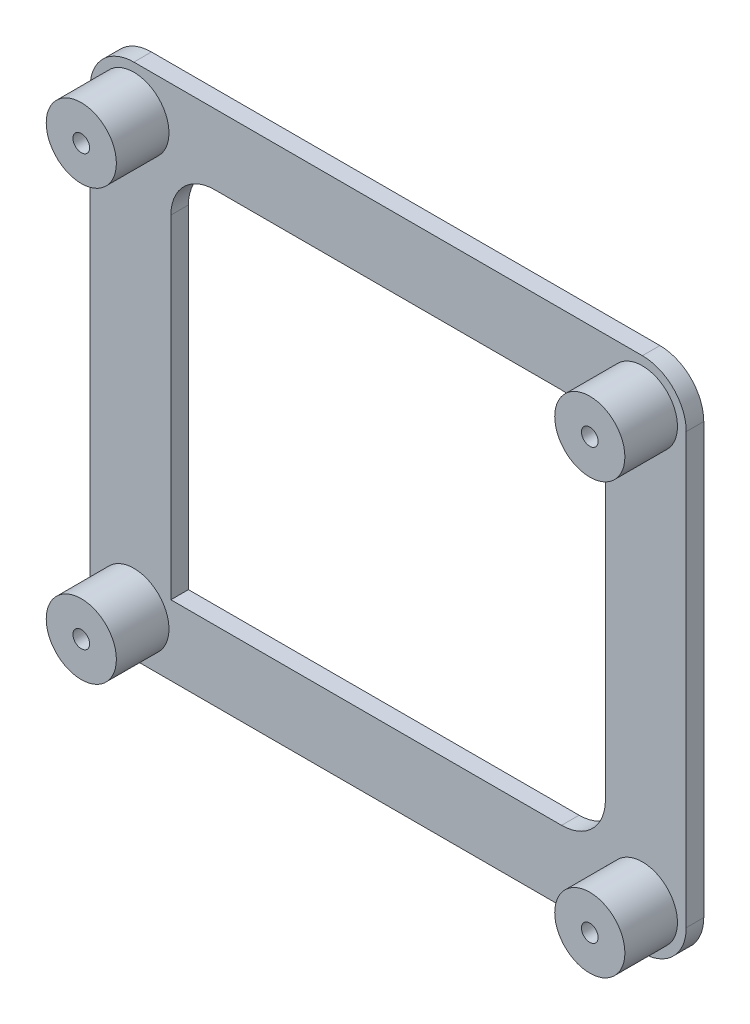
ISO-10303-21;
HEADER;
FILE_DESCRIPTION(('STEP AP214'),'2;1');
FILE_NAME('part.step','',(''),(''),'','','');
FILE_SCHEMA(('AUTOMOTIVE_DESIGN { 1 0 10303 214 1 1 1 1 }'));
ENDSEC;
DATA;
#1=APPLICATION_CONTEXT('core data for automotive mechanical design processes');
#2=APPLICATION_PROTOCOL_DEFINITION('international standard','automotive_design',2000,#1);
#3=PRODUCT_CONTEXT('',#1,'mechanical');
#4=PRODUCT('Part','Part','',(#3));
#5=PRODUCT_RELATED_PRODUCT_CATEGORY('part','',(#4));
#6=PRODUCT_DEFINITION_FORMATION('','',#4);
#7=PRODUCT_DEFINITION_CONTEXT('part definition',#1,'design');
#8=PRODUCT_DEFINITION('design','',#6,#7);
#9=PRODUCT_DEFINITION_SHAPE('','',#8);
#10=(LENGTH_UNIT() NAMED_UNIT(*) SI_UNIT(.MILLI.,.METRE.));
#11=(NAMED_UNIT(*) PLANE_ANGLE_UNIT() SI_UNIT($,.RADIAN.));
#12=(NAMED_UNIT(*) SI_UNIT($,.STERADIAN.) SOLID_ANGLE_UNIT());
#13=UNCERTAINTY_MEASURE_WITH_UNIT(LENGTH_MEASURE(1.E-05),#10,'distance_accuracy_value','');
#14=(GEOMETRIC_REPRESENTATION_CONTEXT(3) GLOBAL_UNCERTAINTY_ASSIGNED_CONTEXT((#13)) GLOBAL_UNIT_ASSIGNED_CONTEXT((#10,
#11,#12)) REPRESENTATION_CONTEXT('',''));
#15=CARTESIAN_POINT('',(0.,0.,0.));
#16=DIRECTION('',(0.,0.,1.));
#17=DIRECTION('',(1.,0.,0.));
#18=AXIS2_PLACEMENT_3D('',#15,#16,#17);
#19=CARTESIAN_POINT('',(0.,0.,2.));
#20=DIRECTION('',(0.,0.,-1.));
#21=DIRECTION('',(-1.,0.,0.));
#22=AXIS2_PLACEMENT_3D('',#19,#20,#21);
#23=PLANE('',#22);
#24=CARTESIAN_POINT('',(29.,-24.5,2.));
#25=DIRECTION('',(0.,0.,-1.));
#26=DIRECTION('',(-1.,0.,0.));
#27=AXIS2_PLACEMENT_3D('',#24,#25,#26);
#28=CIRCLE('',#27,4.);
#29=CARTESIAN_POINT('',(25.,-24.5,2.));
#30=VERTEX_POINT('',#29);
#31=EDGE_CURVE('E221',#30,#30,#28,.F.);
#32=ORIENTED_EDGE('',*,*,#31,.F.);
#33=EDGE_LOOP('',(#32));
#34=FACE_BOUND('',#33,.T.);
#35=CARTESIAN_POINT('',(-29.,24.5,2.));
#36=DIRECTION('',(0.,0.,-1.));
#37=DIRECTION('',(-1.,0.,0.));
#38=AXIS2_PLACEMENT_3D('',#35,#36,#37);
#39=CIRCLE('',#38,4.);
#40=CARTESIAN_POINT('',(-33.,24.5,2.));
#41=VERTEX_POINT('',#40);
#42=EDGE_CURVE('E200',#41,#41,#39,.F.);
#43=ORIENTED_EDGE('',*,*,#42,.F.);
#44=EDGE_LOOP('',(#43));
#45=FACE_BOUND('',#44,.T.);
#46=DIRECTION('',(-1.,0.,0.));
#47=VECTOR('',#46,1.);
#48=CARTESIAN_POINT('',(-34.,29.5,2.));
#49=LINE('',#48,#47);
#50=CARTESIAN_POINT('',(29.,29.5,2.));
#51=VERTEX_POINT('',#50);
#52=CARTESIAN_POINT('',(-29.,29.5,2.));
#53=VERTEX_POINT('',#52);
#54=EDGE_CURVE('E189',#51,#53,#49,.T.);
#55=ORIENTED_EDGE('',*,*,#54,.T.);
#56=CARTESIAN_POINT('',(-29.,24.5,2.));
#57=DIRECTION('',(0.,0.,-1.));
#58=DIRECTION('',(-1.,0.,0.));
#59=AXIS2_PLACEMENT_3D('',#56,#57,#58);
#60=CIRCLE('',#59,5.);
#61=CARTESIAN_POINT('',(-34.,24.5,2.));
#62=VERTEX_POINT('',#61);
#63=EDGE_CURVE('E282',#53,#62,#60,.F.);
#64=ORIENTED_EDGE('',*,*,#63,.T.);
#65=DIRECTION('',(0.,-1.,0.));
#66=VECTOR('',#65,1.);
#67=CARTESIAN_POINT('',(-34.,-29.5,2.));
#68=LINE('',#67,#66);
#69=CARTESIAN_POINT('',(-34.,-24.5,2.));
#70=VERTEX_POINT('',#69);
#71=EDGE_CURVE('E194',#62,#70,#68,.T.);
#72=ORIENTED_EDGE('',*,*,#71,.T.);
#73=CARTESIAN_POINT('',(-29.,-24.5,2.));
#74=DIRECTION('',(0.,0.,-1.));
#75=DIRECTION('',(-1.,0.,0.));
#76=AXIS2_PLACEMENT_3D('',#73,#74,#75);
#77=CIRCLE('',#76,5.);
#78=CARTESIAN_POINT('',(-29.,-29.5,2.));
#79=VERTEX_POINT('',#78);
#80=EDGE_CURVE('E62',#70,#79,#77,.F.);
#81=ORIENTED_EDGE('',*,*,#80,.T.);
#82=DIRECTION('',(1.,0.,0.));
#83=VECTOR('',#82,1.);
#84=CARTESIAN_POINT('',(-34.,-29.5,2.));
#85=LINE('',#84,#83);
#86=CARTESIAN_POINT('',(29.,-29.5,2.));
#87=VERTEX_POINT('',#86);
#88=EDGE_CURVE('E197',#79,#87,#85,.T.);
#89=ORIENTED_EDGE('',*,*,#88,.T.);
#90=CARTESIAN_POINT('',(29.,-24.5,2.));
#91=DIRECTION('',(0.,0.,-1.));
#92=DIRECTION('',(-1.,0.,0.));
#93=AXIS2_PLACEMENT_3D('',#90,#91,#92);
#94=CIRCLE('',#93,5.);
#95=CARTESIAN_POINT('',(34.,-24.5,2.));
#96=VERTEX_POINT('',#95);
#97=EDGE_CURVE('E276',#87,#96,#94,.F.);
#98=ORIENTED_EDGE('',*,*,#97,.T.);
#99=DIRECTION('',(0.,1.,0.));
#100=VECTOR('',#99,1.);
#101=CARTESIAN_POINT('',(34.,-29.5,2.));
#102=LINE('',#101,#100);
#103=CARTESIAN_POINT('',(34.,24.5,2.));
#104=VERTEX_POINT('',#103);
#105=EDGE_CURVE('E185',#96,#104,#102,.T.);
#106=ORIENTED_EDGE('',*,*,#105,.T.);
#107=CARTESIAN_POINT('',(29.,24.5,2.));
#108=DIRECTION('',(0.,0.,-1.));
#109=DIRECTION('',(-1.,0.,0.));
#110=AXIS2_PLACEMENT_3D('',#107,#108,#109);
#111=CIRCLE('',#110,5.);
#112=EDGE_CURVE('E279',#104,#51,#111,.F.);
#113=ORIENTED_EDGE('',*,*,#112,.T.);
#114=EDGE_LOOP('',(#55,#64,#72,#81,#89,#98,#106,#113));
#115=FACE_BOUND('',#114,.T.);
#116=DIRECTION('',(0.,1.,0.));
#117=VECTOR('',#116,1.);
#118=CARTESIAN_POINT('',(24.7796610169492,-21.5,2.));
#119=LINE('',#118,#117);
#120=CARTESIAN_POINT('',(24.7796610169492,-16.5,2.));
#121=VERTEX_POINT('',#120);
#122=CARTESIAN_POINT('',(24.7796610169492,16.5,2.));
#123=VERTEX_POINT('',#122);
#124=EDGE_CURVE('E177',#121,#123,#119,.T.);
#125=ORIENTED_EDGE('',*,*,#124,.F.);
#126=CARTESIAN_POINT('',(19.7796610169492,-16.5,2.));
#127=DIRECTION('',(0.,0.,-1.));
#128=DIRECTION('',(-1.,0.,0.));
#129=AXIS2_PLACEMENT_3D('',#126,#127,#128);
#130=CIRCLE('',#129,5.);
#131=CARTESIAN_POINT('',(19.7796610169492,-21.5,2.));
#132=VERTEX_POINT('',#131);
#133=EDGE_CURVE('E301',#121,#132,#130,.T.);
#134=ORIENTED_EDGE('',*,*,#133,.T.);
#135=DIRECTION('',(1.,0.,0.));
#136=VECTOR('',#135,1.);
#137=CARTESIAN_POINT('',(-24.7796610169492,-21.5,2.));
#138=LINE('',#137,#136);
#139=CARTESIAN_POINT('',(-24.7796610169492,-21.5,2.));
#140=VERTEX_POINT('',#139);
#141=EDGE_CURVE('E170',#140,#132,#138,.T.);
#142=ORIENTED_EDGE('',*,*,#141,.F.);
#143=DIRECTION('',(0.,-1.,0.));
#144=VECTOR('',#143,1.);
#145=CARTESIAN_POINT('',(-24.7796610169492,-21.5,2.));
#146=LINE('',#145,#144);
#147=CARTESIAN_POINT('',(-24.7796610169492,16.5,2.));
#148=VERTEX_POINT('',#147);
#149=EDGE_CURVE('E164',#148,#140,#146,.T.);
#150=ORIENTED_EDGE('',*,*,#149,.F.);
#151=CARTESIAN_POINT('',(-19.7796610169492,16.5,2.));
#152=DIRECTION('',(0.,0.,-1.));
#153=DIRECTION('',(-1.,0.,0.));
#154=AXIS2_PLACEMENT_3D('',#151,#152,#153);
#155=CIRCLE('',#154,5.);
#156=CARTESIAN_POINT('',(-19.7796610169492,21.5,2.));
#157=VERTEX_POINT('',#156);
#158=EDGE_CURVE('E11',#148,#157,#155,.T.);
#159=ORIENTED_EDGE('',*,*,#158,.T.);
#160=DIRECTION('',(-1.,0.,0.));
#161=VECTOR('',#160,1.);
#162=CARTESIAN_POINT('',(-24.7796610169492,21.5,2.));
#163=LINE('',#162,#161);
#164=CARTESIAN_POINT('',(19.7796610169492,21.5,2.));
#165=VERTEX_POINT('',#164);
#166=EDGE_CURVE('E181',#165,#157,#163,.T.);
#167=ORIENTED_EDGE('',*,*,#166,.F.);
#168=CARTESIAN_POINT('',(19.7796610169492,16.5,2.));
#169=DIRECTION('',(0.,0.,-1.));
#170=DIRECTION('',(-1.,0.,0.));
#171=AXIS2_PLACEMENT_3D('',#168,#169,#170);
#172=CIRCLE('',#171,5.);
#173=EDGE_CURVE('E307',#165,#123,#172,.T.);
#174=ORIENTED_EDGE('',*,*,#173,.T.);
#175=EDGE_LOOP('',(#125,#134,#142,#150,#159,#167,#174));
#176=FACE_BOUND('',#175,.T.);
#177=CARTESIAN_POINT('',(29.,24.5,2.));
#178=DIRECTION('',(0.,0.,-1.));
#179=DIRECTION('',(-1.,0.,0.));
#180=AXIS2_PLACEMENT_3D('',#177,#178,#179);
#181=CIRCLE('',#180,4.);
#182=CARTESIAN_POINT('',(25.,24.5,2.));
#183=VERTEX_POINT('',#182);
#184=EDGE_CURVE('E217',#183,#183,#181,.F.);
#185=ORIENTED_EDGE('',*,*,#184,.F.);
#186=EDGE_LOOP('',(#185));
#187=FACE_BOUND('',#186,.T.);
#188=CARTESIAN_POINT('',(-29.,-24.5,2.));
#189=DIRECTION('',(0.,0.,-1.));
#190=DIRECTION('',(-1.,0.,0.));
#191=AXIS2_PLACEMENT_3D('',#188,#189,#190);
#192=CIRCLE('',#191,4.);
#193=CARTESIAN_POINT('',(-33.,-24.5,2.));
#194=VERTEX_POINT('',#193);
#195=EDGE_CURVE('E225',#194,#194,#192,.F.);
#196=ORIENTED_EDGE('',*,*,#195,.F.);
#197=EDGE_LOOP('',(#196));
#198=FACE_BOUND('',#197,.T.);
#199=ADVANCED_FACE('F39',(#34,#45,#115,#176,#187,#198),#23,.F.);
#200=CARTESIAN_POINT('',(0.,0.,0.));
#201=DIRECTION('',(0.,0.,-1.));
#202=DIRECTION('',(-1.,0.,0.));
#203=AXIS2_PLACEMENT_3D('',#200,#201,#202);
#204=PLANE('',#203);
#205=CARTESIAN_POINT('',(29.,-24.5,0.));
#206=DIRECTION('',(0.,0.,1.));
#207=DIRECTION('',(1.,0.,0.));
#208=AXIS2_PLACEMENT_3D('',#205,#206,#207);
#209=CIRCLE('',#208,0.950000000000001);
#210=CARTESIAN_POINT('',(29.95,-24.5,0.));
#211=VERTEX_POINT('',#210);
#212=EDGE_CURVE('E675',#211,#211,#209,.T.);
#213=ORIENTED_EDGE('',*,*,#212,.T.);
#214=EDGE_LOOP('',(#213));
#215=FACE_BOUND('',#214,.T.);
#216=CARTESIAN_POINT('',(-29.,24.5,0.));
#217=DIRECTION('',(0.,0.,1.));
#218=DIRECTION('',(1.,0.,0.));
#219=AXIS2_PLACEMENT_3D('',#216,#217,#218);
#220=CIRCLE('',#219,0.950000000000001);
#221=CARTESIAN_POINT('',(-28.05,24.5,0.));
#222=VERTEX_POINT('',#221);
#223=EDGE_CURVE('E325',#222,#222,#220,.T.);
#224=ORIENTED_EDGE('',*,*,#223,.T.);
#225=EDGE_LOOP('',(#224));
#226=FACE_BOUND('',#225,.T.);
#227=DIRECTION('',(0.,-1.,0.));
#228=VECTOR('',#227,1.);
#229=CARTESIAN_POINT('',(-34.,-29.5,0.));
#230=LINE('',#229,#228);
#231=CARTESIAN_POINT('',(-34.,24.5,0.));
#232=VERTEX_POINT('',#231);
#233=CARTESIAN_POINT('',(-34.,-24.5,0.));
#234=VERTEX_POINT('',#233);
#235=EDGE_CURVE('E208',#232,#234,#230,.T.);
#236=ORIENTED_EDGE('',*,*,#235,.F.);
#237=CARTESIAN_POINT('',(-29.,24.5,0.));
#238=DIRECTION('',(0.,0.,-1.));
#239=DIRECTION('',(-1.,0.,0.));
#240=AXIS2_PLACEMENT_3D('',#237,#238,#239);
#241=CIRCLE('',#240,5.);
#242=CARTESIAN_POINT('',(-29.,29.5,0.));
#243=VERTEX_POINT('',#242);
#244=EDGE_CURVE('E264',#232,#243,#241,.T.);
#245=ORIENTED_EDGE('',*,*,#244,.T.);
#246=DIRECTION('',(-1.,0.,0.));
#247=VECTOR('',#246,1.);
#248=CARTESIAN_POINT('',(-34.,29.5,0.));
#249=LINE('',#248,#247);
#250=CARTESIAN_POINT('',(29.,29.5,0.));
#251=VERTEX_POINT('',#250);
#252=EDGE_CURVE('E204',#251,#243,#249,.T.);
#253=ORIENTED_EDGE('',*,*,#252,.F.);
#254=CARTESIAN_POINT('',(29.,24.5,0.));
#255=DIRECTION('',(0.,0.,-1.));
#256=DIRECTION('',(-1.,0.,0.));
#257=AXIS2_PLACEMENT_3D('',#254,#255,#256);
#258=CIRCLE('',#257,5.);
#259=CARTESIAN_POINT('',(34.,24.5,0.));
#260=VERTEX_POINT('',#259);
#261=EDGE_CURVE('E261',#251,#260,#258,.T.);
#262=ORIENTED_EDGE('',*,*,#261,.T.);
#263=DIRECTION('',(0.,1.,0.));
#264=VECTOR('',#263,1.);
#265=CARTESIAN_POINT('',(34.,-29.5,0.));
#266=LINE('',#265,#264);
#267=CARTESIAN_POINT('',(34.,-24.5,0.));
#268=VERTEX_POINT('',#267);
#269=EDGE_CURVE('E169',#268,#260,#266,.T.);
#270=ORIENTED_EDGE('',*,*,#269,.F.);
#271=CARTESIAN_POINT('',(29.,-24.5,0.));
#272=DIRECTION('',(0.,0.,-1.));
#273=DIRECTION('',(-1.,0.,0.));
#274=AXIS2_PLACEMENT_3D('',#271,#272,#273);
#275=CIRCLE('',#274,5.);
#276=CARTESIAN_POINT('',(29.,-29.5,0.));
#277=VERTEX_POINT('',#276);
#278=EDGE_CURVE('E258',#268,#277,#275,.T.);
#279=ORIENTED_EDGE('',*,*,#278,.T.);
#280=DIRECTION('',(1.,0.,0.));
#281=VECTOR('',#280,1.);
#282=CARTESIAN_POINT('',(-34.,-29.5,0.));
#283=LINE('',#282,#281);
#284=CARTESIAN_POINT('',(-29.,-29.5,0.));
#285=VERTEX_POINT('',#284);
#286=EDGE_CURVE('E190',#285,#277,#283,.T.);
#287=ORIENTED_EDGE('',*,*,#286,.F.);
#288=CARTESIAN_POINT('',(-29.,-24.5,0.));
#289=DIRECTION('',(0.,0.,-1.));
#290=DIRECTION('',(-1.,0.,0.));
#291=AXIS2_PLACEMENT_3D('',#288,#289,#290);
#292=CIRCLE('',#291,5.);
#293=EDGE_CURVE('E255',#285,#234,#292,.T.);
#294=ORIENTED_EDGE('',*,*,#293,.T.);
#295=EDGE_LOOP('',(#236,#245,#253,#262,#270,#279,#287,#294));
#296=FACE_BOUND('',#295,.T.);
#297=DIRECTION('',(1.,0.,0.));
#298=VECTOR('',#297,1.);
#299=CARTESIAN_POINT('',(-24.7796610169492,-21.5,0.));
#300=LINE('',#299,#298);
#301=CARTESIAN_POINT('',(-24.7796610169492,-21.5,0.));
#302=VERTEX_POINT('',#301);
#303=CARTESIAN_POINT('',(19.7796610169492,-21.5,0.));
#304=VERTEX_POINT('',#303);
#305=EDGE_CURVE('E153',#302,#304,#300,.T.);
#306=ORIENTED_EDGE('',*,*,#305,.T.);
#307=CARTESIAN_POINT('',(19.7796610169492,-16.5,0.));
#308=DIRECTION('',(0.,0.,-1.));
#309=DIRECTION('',(-1.,0.,0.));
#310=AXIS2_PLACEMENT_3D('',#307,#308,#309);
#311=CIRCLE('',#310,5.);
#312=CARTESIAN_POINT('',(24.7796610169492,-16.5,0.));
#313=VERTEX_POINT('',#312);
#314=EDGE_CURVE('E298',#304,#313,#311,.F.);
#315=ORIENTED_EDGE('',*,*,#314,.T.);
#316=DIRECTION('',(0.,1.,0.));
#317=VECTOR('',#316,1.);
#318=CARTESIAN_POINT('',(24.7796610169492,-21.5,0.));
#319=LINE('',#318,#317);
#320=CARTESIAN_POINT('',(24.7796610169492,16.5,0.));
#321=VERTEX_POINT('',#320);
#322=EDGE_CURVE('E322',#313,#321,#319,.T.);
#323=ORIENTED_EDGE('',*,*,#322,.T.);
#324=CARTESIAN_POINT('',(19.7796610169492,16.5,0.));
#325=DIRECTION('',(0.,0.,-1.));
#326=DIRECTION('',(-1.,0.,0.));
#327=AXIS2_PLACEMENT_3D('',#324,#325,#326);
#328=CIRCLE('',#327,5.);
#329=CARTESIAN_POINT('',(19.7796610169492,21.5,0.));
#330=VERTEX_POINT('',#329);
#331=EDGE_CURVE('E304',#321,#330,#328,.F.);
#332=ORIENTED_EDGE('',*,*,#331,.T.);
#333=DIRECTION('',(-1.,0.,0.));
#334=VECTOR('',#333,1.);
#335=CARTESIAN_POINT('',(-24.7796610169492,21.5,0.));
#336=LINE('',#335,#334);
#337=CARTESIAN_POINT('',(-19.7796610169492,21.5,0.));
#338=VERTEX_POINT('',#337);
#339=EDGE_CURVE('E158',#330,#338,#336,.T.);
#340=ORIENTED_EDGE('',*,*,#339,.T.);
#341=CARTESIAN_POINT('',(-19.7796610169492,16.5,0.));
#342=DIRECTION('',(0.,0.,-1.));
#343=DIRECTION('',(-1.,0.,0.));
#344=AXIS2_PLACEMENT_3D('',#341,#342,#343);
#345=CIRCLE('',#344,5.);
#346=CARTESIAN_POINT('',(-24.7796610169492,16.5,0.));
#347=VERTEX_POINT('',#346);
#348=EDGE_CURVE('E48',#338,#347,#345,.F.);
#349=ORIENTED_EDGE('',*,*,#348,.T.);
#350=DIRECTION('',(0.,-1.,0.));
#351=VECTOR('',#350,1.);
#352=CARTESIAN_POINT('',(-24.7796610169492,-21.5,0.));
#353=LINE('',#352,#351);
#354=EDGE_CURVE('E148',#347,#302,#353,.T.);
#355=ORIENTED_EDGE('',*,*,#354,.T.);
#356=EDGE_LOOP('',(#306,#315,#323,#332,#340,#349,#355));
#357=FACE_BOUND('',#356,.T.);
#358=CARTESIAN_POINT('',(29.,24.5,0.));
#359=DIRECTION('',(0.,0.,1.));
#360=DIRECTION('',(1.,0.,0.));
#361=AXIS2_PLACEMENT_3D('',#358,#359,#360);
#362=CIRCLE('',#361,0.950000000000001);
#363=CARTESIAN_POINT('',(29.95,24.5,0.));
#364=VERTEX_POINT('',#363);
#365=EDGE_CURVE('E679',#364,#364,#362,.T.);
#366=ORIENTED_EDGE('',*,*,#365,.T.);
#367=EDGE_LOOP('',(#366));
#368=FACE_BOUND('',#367,.T.);
#369=CARTESIAN_POINT('',(-29.,-24.5,0.));
#370=DIRECTION('',(0.,0.,1.));
#371=DIRECTION('',(1.,0.,0.));
#372=AXIS2_PLACEMENT_3D('',#369,#370,#371);
#373=CIRCLE('',#372,0.950000000000001);
#374=CARTESIAN_POINT('',(-28.05,-24.5,0.));
#375=VERTEX_POINT('',#374);
#376=EDGE_CURVE('E665',#375,#375,#373,.T.);
#377=ORIENTED_EDGE('',*,*,#376,.T.);
#378=EDGE_LOOP('',(#377));
#379=FACE_BOUND('',#378,.T.);
#380=ADVANCED_FACE('F150',(#215,#226,#296,#357,#368,#379),#204,.T.);
#381=CARTESIAN_POINT('',(34.,-29.5,2.));
#382=DIRECTION('',(-1.,0.,0.));
#383=DIRECTION('',(0.,0.,1.));
#384=AXIS2_PLACEMENT_3D('',#381,#382,#383);
#385=PLANE('',#384);
#386=ORIENTED_EDGE('',*,*,#269,.T.);
#387=DIRECTION('',(0.,0.,-1.));
#388=VECTOR('',#387,1.);
#389=CARTESIAN_POINT('',(34.,24.5,2.));
#390=LINE('',#389,#388);
#391=EDGE_CURVE('E289',#260,#104,#390,.F.);
#392=ORIENTED_EDGE('',*,*,#391,.T.);
#393=ORIENTED_EDGE('',*,*,#105,.F.);
#394=DIRECTION('',(0.,0.,-1.));
#395=VECTOR('',#394,1.);
#396=CARTESIAN_POINT('',(34.,-24.5,2.));
#397=LINE('',#396,#395);
#398=EDGE_CURVE('E285',#96,#268,#397,.T.);
#399=ORIENTED_EDGE('',*,*,#398,.T.);
#400=EDGE_LOOP('',(#386,#392,#393,#399));
#401=FACE_BOUND('',#400,.T.);
#402=ADVANCED_FACE('F364',(#401),#385,.F.);
#403=CARTESIAN_POINT('',(-34.,29.5,2.));
#404=DIRECTION('',(0.,-1.,0.));
#405=DIRECTION('',(0.,0.,-1.));
#406=AXIS2_PLACEMENT_3D('',#403,#404,#405);
#407=PLANE('',#406);
#408=ORIENTED_EDGE('',*,*,#252,.T.);
#409=DIRECTION('',(0.,0.,-1.));
#410=VECTOR('',#409,1.);
#411=CARTESIAN_POINT('',(-29.,29.5,2.));
#412=LINE('',#411,#410);
#413=EDGE_CURVE('E271',#243,#53,#412,.F.);
#414=ORIENTED_EDGE('',*,*,#413,.T.);
#415=ORIENTED_EDGE('',*,*,#54,.F.);
#416=DIRECTION('',(0.,0.,-1.));
#417=VECTOR('',#416,1.);
#418=CARTESIAN_POINT('',(29.,29.5,2.));
#419=LINE('',#418,#417);
#420=EDGE_CURVE('E267',#51,#251,#419,.T.);
#421=ORIENTED_EDGE('',*,*,#420,.T.);
#422=EDGE_LOOP('',(#408,#414,#415,#421));
#423=FACE_BOUND('',#422,.T.);
#424=ADVANCED_FACE('F378',(#423),#407,.F.);
#425=CARTESIAN_POINT('',(-34.,-29.5,2.));
#426=DIRECTION('',(1.,0.,0.));
#427=DIRECTION('',(0.,0.,-1.));
#428=AXIS2_PLACEMENT_3D('',#425,#426,#427);
#429=PLANE('',#428);
#430=ORIENTED_EDGE('',*,*,#71,.F.);
#431=DIRECTION('',(0.,0.,-1.));
#432=VECTOR('',#431,1.);
#433=CARTESIAN_POINT('',(-34.,24.5,2.));
#434=LINE('',#433,#432);
#435=EDGE_CURVE('E251',#62,#232,#434,.T.);
#436=ORIENTED_EDGE('',*,*,#435,.T.);
#437=ORIENTED_EDGE('',*,*,#235,.T.);
#438=DIRECTION('',(0.,0.,-1.));
#439=VECTOR('',#438,1.);
#440=CARTESIAN_POINT('',(-34.,-24.5,2.));
#441=LINE('',#440,#439);
#442=EDGE_CURVE('E248',#234,#70,#441,.F.);
#443=ORIENTED_EDGE('',*,*,#442,.T.);
#444=EDGE_LOOP('',(#430,#436,#437,#443));
#445=FACE_BOUND('',#444,.T.);
#446=ADVANCED_FACE('F375',(#445),#429,.F.);
#447=CARTESIAN_POINT('',(-34.,-29.5,2.));
#448=DIRECTION('',(0.,1.,0.));
#449=DIRECTION('',(0.,0.,1.));
#450=AXIS2_PLACEMENT_3D('',#447,#448,#449);
#451=PLANE('',#450);
#452=ORIENTED_EDGE('',*,*,#286,.T.);
#453=DIRECTION('',(0.,0.,-1.));
#454=VECTOR('',#453,1.);
#455=CARTESIAN_POINT('',(29.,-29.5,2.));
#456=LINE('',#455,#454);
#457=EDGE_CURVE('E55',#277,#87,#456,.F.);
#458=ORIENTED_EDGE('',*,*,#457,.T.);
#459=ORIENTED_EDGE('',*,*,#88,.F.);
#460=DIRECTION('',(0.,0.,-1.));
#461=VECTOR('',#460,1.);
#462=CARTESIAN_POINT('',(-29.,-29.5,2.));
#463=LINE('',#462,#461);
#464=EDGE_CURVE('E292',#79,#285,#463,.T.);
#465=ORIENTED_EDGE('',*,*,#464,.T.);
#466=EDGE_LOOP('',(#452,#458,#459,#465));
#467=FACE_BOUND('',#466,.T.);
#468=ADVANCED_FACE('F372',(#467),#451,.F.);
#469=CARTESIAN_POINT('',(24.7796610169492,-21.5,2.));
#470=DIRECTION('',(-1.,0.,0.));
#471=DIRECTION('',(0.,0.,1.));
#472=AXIS2_PLACEMENT_3D('',#469,#470,#471);
#473=PLANE('',#472);
#474=ORIENTED_EDGE('',*,*,#322,.F.);
#475=DIRECTION('',(0.,0.,-1.));
#476=VECTOR('',#475,1.);
#477=CARTESIAN_POINT('',(24.7796610169492,-16.5,2.));
#478=LINE('',#477,#476);
#479=EDGE_CURVE('E235',#313,#121,#478,.F.);
#480=ORIENTED_EDGE('',*,*,#479,.T.);
#481=ORIENTED_EDGE('',*,*,#124,.T.);
#482=DIRECTION('',(0.,0.,-1.));
#483=VECTOR('',#482,1.);
#484=CARTESIAN_POINT('',(24.7796610169492,16.5,0.));
#485=LINE('',#484,#483);
#486=EDGE_CURVE('E231',#123,#321,#485,.T.);
#487=ORIENTED_EDGE('',*,*,#486,.T.);
#488=EDGE_LOOP('',(#474,#480,#481,#487));
#489=FACE_BOUND('',#488,.T.);
#490=ADVANCED_FACE('F340',(#489),#473,.T.);
#491=CARTESIAN_POINT('',(-24.7796610169492,21.5,2.));
#492=DIRECTION('',(0.,-1.,0.));
#493=DIRECTION('',(0.,0.,-1.));
#494=AXIS2_PLACEMENT_3D('',#491,#492,#493);
#495=PLANE('',#494);
#496=ORIENTED_EDGE('',*,*,#339,.F.);
#497=DIRECTION('',(0.,0.,-1.));
#498=VECTOR('',#497,1.);
#499=CARTESIAN_POINT('',(19.7796610169492,21.5,2.));
#500=LINE('',#499,#498);
#501=EDGE_CURVE('E242',#330,#165,#500,.F.);
#502=ORIENTED_EDGE('',*,*,#501,.T.);
#503=ORIENTED_EDGE('',*,*,#166,.T.);
#504=DIRECTION('',(0.,0.,-1.));
#505=VECTOR('',#504,1.);
#506=CARTESIAN_POINT('',(-19.7796610169492,21.5,0.));
#507=LINE('',#506,#505);
#508=EDGE_CURVE('E238',#157,#338,#507,.T.);
#509=ORIENTED_EDGE('',*,*,#508,.T.);
#510=EDGE_LOOP('',(#496,#502,#503,#509));
#511=FACE_BOUND('',#510,.T.);
#512=ADVANCED_FACE('F329',(#511),#495,.T.);
#513=CARTESIAN_POINT('',(-24.7796610169492,-21.5,2.));
#514=DIRECTION('',(1.,0.,0.));
#515=DIRECTION('',(0.,0.,-1.));
#516=AXIS2_PLACEMENT_3D('',#513,#514,#515);
#517=PLANE('',#516);
#518=ORIENTED_EDGE('',*,*,#354,.F.);
#519=DIRECTION('',(0.,0.,-1.));
#520=VECTOR('',#519,1.);
#521=CARTESIAN_POINT('',(-24.7796610169492,16.5,2.));
#522=LINE('',#521,#520);
#523=EDGE_CURVE('E245',#347,#148,#522,.F.);
#524=ORIENTED_EDGE('',*,*,#523,.T.);
#525=ORIENTED_EDGE('',*,*,#149,.T.);
#526=DIRECTION('',(0.,0.,-1.));
#527=VECTOR('',#526,1.);
#528=CARTESIAN_POINT('',(-24.7796610169492,-21.5,2.));
#529=LINE('',#528,#527);
#530=EDGE_CURVE('E161',#140,#302,#529,.T.);
#531=ORIENTED_EDGE('',*,*,#530,.T.);
#532=EDGE_LOOP('',(#518,#524,#525,#531));
#533=FACE_BOUND('',#532,.T.);
#534=ADVANCED_FACE('F162',(#533),#517,.T.);
#535=CARTESIAN_POINT('',(-24.7796610169492,-21.5,2.));
#536=DIRECTION('',(0.,1.,0.));
#537=DIRECTION('',(0.,0.,1.));
#538=AXIS2_PLACEMENT_3D('',#535,#536,#537);
#539=PLANE('',#538);
#540=ORIENTED_EDGE('',*,*,#141,.T.);
#541=DIRECTION('',(0.,0.,-1.));
#542=VECTOR('',#541,1.);
#543=CARTESIAN_POINT('',(19.7796610169492,-21.5,0.));
#544=LINE('',#543,#542);
#545=EDGE_CURVE('E175',#132,#304,#544,.T.);
#546=ORIENTED_EDGE('',*,*,#545,.T.);
#547=ORIENTED_EDGE('',*,*,#305,.F.);
#548=ORIENTED_EDGE('',*,*,#530,.F.);
#549=EDGE_LOOP('',(#540,#546,#547,#548));
#550=FACE_BOUND('',#549,.T.);
#551=ADVANCED_FACE('F173',(#550),#539,.T.);
#552=CARTESIAN_POINT('',(-29.,24.5,2.));
#553=DIRECTION('',(0.,0.,-1.));
#554=DIRECTION('',(-1.,0.,0.));
#555=AXIS2_PLACEMENT_3D('',#552,#553,#554);
#556=CYLINDRICAL_SURFACE('',#555,0.950000000000001);
#557=ORIENTED_EDGE('',*,*,#223,.F.);
#558=EDGE_LOOP('',(#557));
#559=FACE_BOUND('',#558,.T.);
#560=CARTESIAN_POINT('',(-29.,24.5,8.));
#561=DIRECTION('',(0.,0.,1.));
#562=DIRECTION('',(1.,0.,0.));
#563=AXIS2_PLACEMENT_3D('',#560,#561,#562);
#564=CIRCLE('',#563,0.950000000000001);
#565=CARTESIAN_POINT('',(-28.05,24.5,8.));
#566=VERTEX_POINT('',#565);
#567=EDGE_CURVE('E656',#566,#566,#564,.T.);
#568=ORIENTED_EDGE('',*,*,#567,.T.);
#569=EDGE_LOOP('',(#568));
#570=FACE_BOUND('',#569,.T.);
#571=ADVANCED_FACE('F437',(#559,#570),#556,.F.);
#572=CARTESIAN_POINT('',(29.,24.5,2.));
#573=DIRECTION('',(0.,0.,-1.));
#574=DIRECTION('',(-1.,0.,0.));
#575=AXIS2_PLACEMENT_3D('',#572,#573,#574);
#576=CYLINDRICAL_SURFACE('',#575,0.950000000000001);
#577=ORIENTED_EDGE('',*,*,#365,.F.);
#578=EDGE_LOOP('',(#577));
#579=FACE_BOUND('',#578,.T.);
#580=CARTESIAN_POINT('',(29.,24.5,8.));
#581=DIRECTION('',(0.,0.,1.));
#582=DIRECTION('',(1.,0.,0.));
#583=AXIS2_PLACEMENT_3D('',#580,#581,#582);
#584=CIRCLE('',#583,0.950000000000001);
#585=CARTESIAN_POINT('',(29.95,24.5,8.));
#586=VERTEX_POINT('',#585);
#587=EDGE_CURVE('E668',#586,#586,#584,.T.);
#588=ORIENTED_EDGE('',*,*,#587,.T.);
#589=EDGE_LOOP('',(#588));
#590=FACE_BOUND('',#589,.T.);
#591=ADVANCED_FACE('F433',(#579,#590),#576,.F.);
#592=CARTESIAN_POINT('',(29.,-24.5,2.));
#593=DIRECTION('',(0.,0.,-1.));
#594=DIRECTION('',(-1.,0.,0.));
#595=AXIS2_PLACEMENT_3D('',#592,#593,#594);
#596=CYLINDRICAL_SURFACE('',#595,0.950000000000001);
#597=ORIENTED_EDGE('',*,*,#212,.F.);
#598=EDGE_LOOP('',(#597));
#599=FACE_BOUND('',#598,.T.);
#600=CARTESIAN_POINT('',(29.,-24.5,8.));
#601=DIRECTION('',(0.,0.,1.));
#602=DIRECTION('',(1.,0.,0.));
#603=AXIS2_PLACEMENT_3D('',#600,#601,#602);
#604=CIRCLE('',#603,0.950000000000001);
#605=CARTESIAN_POINT('',(29.95,-24.5,8.));
#606=VERTEX_POINT('',#605);
#607=EDGE_CURVE('E694',#606,#606,#604,.T.);
#608=ORIENTED_EDGE('',*,*,#607,.T.);
#609=EDGE_LOOP('',(#608));
#610=FACE_BOUND('',#609,.T.);
#611=ADVANCED_FACE('F429',(#599,#610),#596,.F.);
#612=CARTESIAN_POINT('',(-29.,-24.5,2.));
#613=DIRECTION('',(0.,0.,-1.));
#614=DIRECTION('',(-1.,0.,0.));
#615=AXIS2_PLACEMENT_3D('',#612,#613,#614);
#616=CYLINDRICAL_SURFACE('',#615,0.950000000000001);
#617=ORIENTED_EDGE('',*,*,#376,.F.);
#618=EDGE_LOOP('',(#617));
#619=FACE_BOUND('',#618,.T.);
#620=CARTESIAN_POINT('',(-29.,-24.5,8.));
#621=DIRECTION('',(0.,0.,1.));
#622=DIRECTION('',(1.,0.,0.));
#623=AXIS2_PLACEMENT_3D('',#620,#621,#622);
#624=CIRCLE('',#623,0.950000000000001);
#625=CARTESIAN_POINT('',(-28.05,-24.5,8.));
#626=VERTEX_POINT('',#625);
#627=EDGE_CURVE('E704',#626,#626,#624,.T.);
#628=ORIENTED_EDGE('',*,*,#627,.T.);
#629=EDGE_LOOP('',(#628));
#630=FACE_BOUND('',#629,.T.);
#631=ADVANCED_FACE('F422',(#619,#630),#616,.F.);
#632=CARTESIAN_POINT('',(-29.,24.5,8.));
#633=DIRECTION('',(0.,0.,1.));
#634=DIRECTION('',(1.,0.,0.));
#635=AXIS2_PLACEMENT_3D('',#632,#633,#634);
#636=PLANE('',#635);
#637=CARTESIAN_POINT('',(-29.,24.5,8.));
#638=DIRECTION('',(0.,0.,1.));
#639=DIRECTION('',(1.,0.,0.));
#640=AXIS2_PLACEMENT_3D('',#637,#638,#639);
#641=CIRCLE('',#640,4.);
#642=CARTESIAN_POINT('',(-25.,24.5,8.));
#643=VERTEX_POINT('',#642);
#644=EDGE_CURVE('E659',#643,#643,#641,.T.);
#645=ORIENTED_EDGE('',*,*,#644,.T.);
#646=EDGE_LOOP('',(#645));
#647=FACE_BOUND('',#646,.T.);
#648=ORIENTED_EDGE('',*,*,#567,.F.);
#649=EDGE_LOOP('',(#648));
#650=FACE_BOUND('',#649,.T.);
#651=ADVANCED_FACE('F419',(#647,#650),#636,.T.);
#652=CARTESIAN_POINT('',(-29.,24.5,8.));
#653=DIRECTION('',(0.,0.,-1.));
#654=DIRECTION('',(-1.,0.,0.));
#655=AXIS2_PLACEMENT_3D('',#652,#653,#654);
#656=CYLINDRICAL_SURFACE('',#655,4.);
#657=ORIENTED_EDGE('',*,*,#644,.F.);
#658=EDGE_LOOP('',(#657));
#659=FACE_BOUND('',#658,.T.);
#660=ORIENTED_EDGE('',*,*,#42,.T.);
#661=EDGE_LOOP('',(#660));
#662=FACE_BOUND('',#661,.T.);
#663=ADVANCED_FACE('F414',(#659,#662),#656,.T.);
#664=CARTESIAN_POINT('',(29.,24.5,8.));
#665=DIRECTION('',(0.,0.,1.));
#666=DIRECTION('',(1.,0.,0.));
#667=AXIS2_PLACEMENT_3D('',#664,#665,#666);
#668=PLANE('',#667);
#669=CARTESIAN_POINT('',(29.,24.5,8.));
#670=DIRECTION('',(0.,0.,1.));
#671=DIRECTION('',(1.,0.,0.));
#672=AXIS2_PLACEMENT_3D('',#669,#670,#671);
#673=CIRCLE('',#672,4.);
#674=CARTESIAN_POINT('',(33.,24.5,8.));
#675=VERTEX_POINT('',#674);
#676=EDGE_CURVE('E660',#675,#675,#673,.T.);
#677=ORIENTED_EDGE('',*,*,#676,.T.);
#678=EDGE_LOOP('',(#677));
#679=FACE_BOUND('',#678,.T.);
#680=ORIENTED_EDGE('',*,*,#587,.F.);
#681=EDGE_LOOP('',(#680));
#682=FACE_BOUND('',#681,.T.);
#683=ADVANCED_FACE('F411',(#679,#682),#668,.T.);
#684=CARTESIAN_POINT('',(29.,24.5,8.));
#685=DIRECTION('',(0.,0.,-1.));
#686=DIRECTION('',(-1.,0.,0.));
#687=AXIS2_PLACEMENT_3D('',#684,#685,#686);
#688=CYLINDRICAL_SURFACE('',#687,4.);
#689=ORIENTED_EDGE('',*,*,#676,.F.);
#690=EDGE_LOOP('',(#689));
#691=FACE_BOUND('',#690,.T.);
#692=ORIENTED_EDGE('',*,*,#184,.T.);
#693=EDGE_LOOP('',(#692));
#694=FACE_BOUND('',#693,.T.);
#695=ADVANCED_FACE('F406',(#691,#694),#688,.T.);
#696=CARTESIAN_POINT('',(29.,-24.5,8.));
#697=DIRECTION('',(0.,0.,1.));
#698=DIRECTION('',(1.,0.,0.));
#699=AXIS2_PLACEMENT_3D('',#696,#697,#698);
#700=PLANE('',#699);
#701=CARTESIAN_POINT('',(29.,-24.5,8.));
#702=DIRECTION('',(0.,0.,1.));
#703=DIRECTION('',(1.,0.,0.));
#704=AXIS2_PLACEMENT_3D('',#701,#702,#703);
#705=CIRCLE('',#704,4.);
#706=CARTESIAN_POINT('',(33.,-24.5,8.));
#707=VERTEX_POINT('',#706);
#708=EDGE_CURVE('E691',#707,#707,#705,.T.);
#709=ORIENTED_EDGE('',*,*,#708,.T.);
#710=EDGE_LOOP('',(#709));
#711=FACE_BOUND('',#710,.T.);
#712=ORIENTED_EDGE('',*,*,#607,.F.);
#713=EDGE_LOOP('',(#712));
#714=FACE_BOUND('',#713,.T.);
#715=ADVANCED_FACE('F403',(#711,#714),#700,.T.);
#716=CARTESIAN_POINT('',(29.,-24.5,8.));
#717=DIRECTION('',(0.,0.,-1.));
#718=DIRECTION('',(-1.,0.,0.));
#719=AXIS2_PLACEMENT_3D('',#716,#717,#718);
#720=CYLINDRICAL_SURFACE('',#719,4.);
#721=ORIENTED_EDGE('',*,*,#708,.F.);
#722=EDGE_LOOP('',(#721));
#723=FACE_BOUND('',#722,.T.);
#724=ORIENTED_EDGE('',*,*,#31,.T.);
#725=EDGE_LOOP('',(#724));
#726=FACE_BOUND('',#725,.T.);
#727=ADVANCED_FACE('F397',(#723,#726),#720,.T.);
#728=CARTESIAN_POINT('',(-29.,-24.5,8.));
#729=DIRECTION('',(0.,0.,1.));
#730=DIRECTION('',(1.,0.,0.));
#731=AXIS2_PLACEMENT_3D('',#728,#729,#730);
#732=PLANE('',#731);
#733=CARTESIAN_POINT('',(-29.,-24.5,8.));
#734=DIRECTION('',(0.,0.,1.));
#735=DIRECTION('',(1.,0.,0.));
#736=AXIS2_PLACEMENT_3D('',#733,#734,#735);
#737=CIRCLE('',#736,4.);
#738=CARTESIAN_POINT('',(-25.,-24.5,8.));
#739=VERTEX_POINT('',#738);
#740=EDGE_CURVE('E700',#739,#739,#737,.T.);
#741=ORIENTED_EDGE('',*,*,#740,.T.);
#742=EDGE_LOOP('',(#741));
#743=FACE_BOUND('',#742,.T.);
#744=ORIENTED_EDGE('',*,*,#627,.F.);
#745=EDGE_LOOP('',(#744));
#746=FACE_BOUND('',#745,.T.);
#747=ADVANCED_FACE('F391',(#743,#746),#732,.T.);
#748=CARTESIAN_POINT('',(-29.,-24.5,8.));
#749=DIRECTION('',(0.,0.,-1.));
#750=DIRECTION('',(-1.,0.,0.));
#751=AXIS2_PLACEMENT_3D('',#748,#749,#750);
#752=CYLINDRICAL_SURFACE('',#751,4.);
#753=ORIENTED_EDGE('',*,*,#740,.F.);
#754=EDGE_LOOP('',(#753));
#755=FACE_BOUND('',#754,.T.);
#756=ORIENTED_EDGE('',*,*,#195,.T.);
#757=EDGE_LOOP('',(#756));
#758=FACE_BOUND('',#757,.T.);
#759=ADVANCED_FACE('F387',(#755,#758),#752,.T.);
#760=CARTESIAN_POINT('',(19.7796610169492,-16.5,2.));
#761=DIRECTION('',(0.,0.,1.));
#762=DIRECTION('',(1.,0.,0.));
#763=AXIS2_PLACEMENT_3D('',#760,#761,#762);
#764=CYLINDRICAL_SURFACE('',#763,5.);
#765=ORIENTED_EDGE('',*,*,#133,.F.);
#766=ORIENTED_EDGE('',*,*,#479,.F.);
#767=ORIENTED_EDGE('',*,*,#314,.F.);
#768=ORIENTED_EDGE('',*,*,#545,.F.);
#769=EDGE_LOOP('',(#765,#766,#767,#768));
#770=FACE_BOUND('',#769,.T.);
#771=ADVANCED_FACE('F343',(#770),#764,.F.);
#772=CARTESIAN_POINT('',(19.7796610169492,16.5,2.));
#773=DIRECTION('',(0.,0.,1.));
#774=DIRECTION('',(1.,0.,0.));
#775=AXIS2_PLACEMENT_3D('',#772,#773,#774);
#776=CYLINDRICAL_SURFACE('',#775,5.);
#777=ORIENTED_EDGE('',*,*,#173,.F.);
#778=ORIENTED_EDGE('',*,*,#501,.F.);
#779=ORIENTED_EDGE('',*,*,#331,.F.);
#780=ORIENTED_EDGE('',*,*,#486,.F.);
#781=EDGE_LOOP('',(#777,#778,#779,#780));
#782=FACE_BOUND('',#781,.T.);
#783=ADVANCED_FACE('F332',(#782),#776,.F.);
#784=CARTESIAN_POINT('',(-19.7796610169492,16.5,2.));
#785=DIRECTION('',(0.,0.,1.));
#786=DIRECTION('',(1.,0.,0.));
#787=AXIS2_PLACEMENT_3D('',#784,#785,#786);
#788=CYLINDRICAL_SURFACE('',#787,5.);
#789=ORIENTED_EDGE('',*,*,#158,.F.);
#790=ORIENTED_EDGE('',*,*,#523,.F.);
#791=ORIENTED_EDGE('',*,*,#348,.F.);
#792=ORIENTED_EDGE('',*,*,#508,.F.);
#793=EDGE_LOOP('',(#789,#790,#791,#792));
#794=FACE_BOUND('',#793,.T.);
#795=ADVANCED_FACE('F346',(#794),#788,.F.);
#796=CARTESIAN_POINT('',(-29.,24.5,2.));
#797=DIRECTION('',(0.,0.,-1.));
#798=DIRECTION('',(-1.,0.,0.));
#799=AXIS2_PLACEMENT_3D('',#796,#797,#798);
#800=CYLINDRICAL_SURFACE('',#799,5.);
#801=ORIENTED_EDGE('',*,*,#63,.F.);
#802=ORIENTED_EDGE('',*,*,#413,.F.);
#803=ORIENTED_EDGE('',*,*,#244,.F.);
#804=ORIENTED_EDGE('',*,*,#435,.F.);
#805=EDGE_LOOP('',(#801,#802,#803,#804));
#806=FACE_BOUND('',#805,.T.);
#807=ADVANCED_FACE('F348',(#806),#800,.T.);
#808=CARTESIAN_POINT('',(29.,24.5,2.));
#809=DIRECTION('',(0.,0.,-1.));
#810=DIRECTION('',(-1.,0.,0.));
#811=AXIS2_PLACEMENT_3D('',#808,#809,#810);
#812=CYLINDRICAL_SURFACE('',#811,5.);
#813=ORIENTED_EDGE('',*,*,#112,.F.);
#814=ORIENTED_EDGE('',*,*,#391,.F.);
#815=ORIENTED_EDGE('',*,*,#261,.F.);
#816=ORIENTED_EDGE('',*,*,#420,.F.);
#817=EDGE_LOOP('',(#813,#814,#815,#816));
#818=FACE_BOUND('',#817,.T.);
#819=ADVANCED_FACE('F354',(#818),#812,.T.);
#820=CARTESIAN_POINT('',(29.,-24.5,2.));
#821=DIRECTION('',(0.,0.,-1.));
#822=DIRECTION('',(-1.,0.,0.));
#823=AXIS2_PLACEMENT_3D('',#820,#821,#822);
#824=CYLINDRICAL_SURFACE('',#823,5.);
#825=ORIENTED_EDGE('',*,*,#97,.F.);
#826=ORIENTED_EDGE('',*,*,#457,.F.);
#827=ORIENTED_EDGE('',*,*,#278,.F.);
#828=ORIENTED_EDGE('',*,*,#398,.F.);
#829=EDGE_LOOP('',(#825,#826,#827,#828));
#830=FACE_BOUND('',#829,.T.);
#831=ADVANCED_FACE('F612',(#830),#824,.T.);
#832=CARTESIAN_POINT('',(-29.,-24.5,2.));
#833=DIRECTION('',(0.,0.,-1.));
#834=DIRECTION('',(-1.,0.,0.));
#835=AXIS2_PLACEMENT_3D('',#832,#833,#834);
#836=CYLINDRICAL_SURFACE('',#835,5.);
#837=ORIENTED_EDGE('',*,*,#80,.F.);
#838=ORIENTED_EDGE('',*,*,#442,.F.);
#839=ORIENTED_EDGE('',*,*,#293,.F.);
#840=ORIENTED_EDGE('',*,*,#464,.F.);
#841=EDGE_LOOP('',(#837,#838,#839,#840));
#842=FACE_BOUND('',#841,.T.);
#843=ADVANCED_FACE('F41',(#842),#836,.T.);
#844=CLOSED_SHELL('',(#199,#380,#402,#424,#446,#468,#490,#512,#534,#551,#571,#591,#611,#631,
#651,#663,#683,#695,#715,#727,#747,#759,#771,#783,#795,#807,#819,#831,#843));
#845=MANIFOLD_SOLID_BREP('B2',#844);
#846=ADVANCED_BREP_SHAPE_REPRESENTATION('',(#18,#845),#14);
#847=SHAPE_DEFINITION_REPRESENTATION(#9,#846);
ENDSEC;
END-ISO-10303-21;
